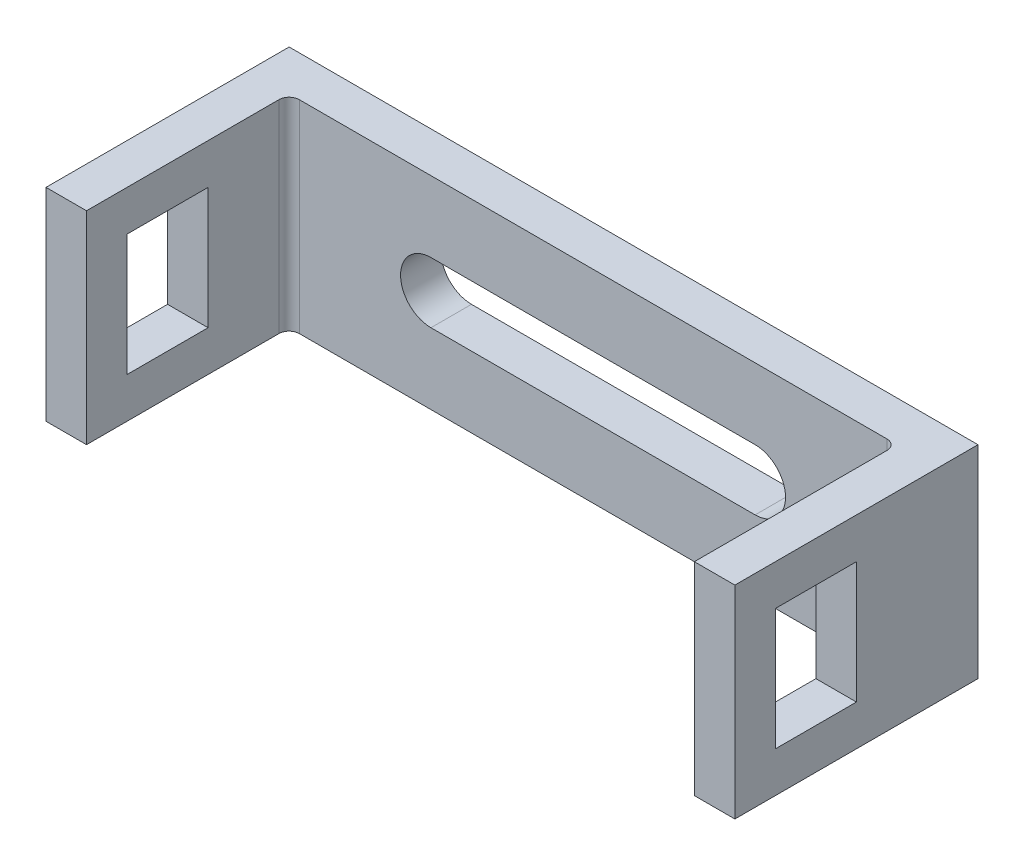
ISO-10303-21;
HEADER;
FILE_DESCRIPTION(('STEP AP214'),'2;1');
FILE_NAME('part.step','',(''),(''),'','','');
FILE_SCHEMA(('AUTOMOTIVE_DESIGN { 1 0 10303 214 1 1 1 1 }'));
ENDSEC;
DATA;
#1=APPLICATION_CONTEXT('core data for automotive mechanical design processes');
#2=APPLICATION_PROTOCOL_DEFINITION('international standard','automotive_design',2000,#1);
#3=PRODUCT_CONTEXT('',#1,'mechanical');
#4=PRODUCT('Part','Part','',(#3));
#5=PRODUCT_RELATED_PRODUCT_CATEGORY('part','',(#4));
#6=PRODUCT_DEFINITION_FORMATION('','',#4);
#7=PRODUCT_DEFINITION_CONTEXT('part definition',#1,'design');
#8=PRODUCT_DEFINITION('design','',#6,#7);
#9=PRODUCT_DEFINITION_SHAPE('','',#8);
#10=(LENGTH_UNIT() NAMED_UNIT(*) SI_UNIT(.MILLI.,.METRE.));
#11=(NAMED_UNIT(*) PLANE_ANGLE_UNIT() SI_UNIT($,.RADIAN.));
#12=(NAMED_UNIT(*) SI_UNIT($,.STERADIAN.) SOLID_ANGLE_UNIT());
#13=UNCERTAINTY_MEASURE_WITH_UNIT(LENGTH_MEASURE(1.E-05),#10,'distance_accuracy_value','');
#14=(GEOMETRIC_REPRESENTATION_CONTEXT(3) GLOBAL_UNCERTAINTY_ASSIGNED_CONTEXT((#13)) GLOBAL_UNIT_ASSIGNED_CONTEXT((#10,
#11,#12)) REPRESENTATION_CONTEXT('',''));
#15=CARTESIAN_POINT('',(0.,0.,0.));
#16=DIRECTION('',(0.,0.,1.));
#17=DIRECTION('',(1.,0.,0.));
#18=AXIS2_PLACEMENT_3D('',#15,#16,#17);
#19=CARTESIAN_POINT('',(17.,5.,2.));
#20=DIRECTION('',(-1.,0.,0.));
#21=DIRECTION('',(0.,0.,1.));
#22=AXIS2_PLACEMENT_3D('',#19,#20,#21);
#23=PLANE('',#22);
#24=DIRECTION('',(0.,0.,1.));
#25=VECTOR('',#24,1.);
#26=CARTESIAN_POINT('',(17.,-3.,2.));
#27=LINE('',#26,#25);
#28=CARTESIAN_POINT('',(17.,-3.,6.));
#29=VERTEX_POINT('',#28);
#30=CARTESIAN_POINT('',(17.,-3.,10.));
#31=VERTEX_POINT('',#30);
#32=EDGE_CURVE('E207',#29,#31,#27,.T.);
#33=ORIENTED_EDGE('',*,*,#32,.T.);
#34=DIRECTION('',(0.,1.,0.));
#35=VECTOR('',#34,1.);
#36=CARTESIAN_POINT('',(17.,5.,10.));
#37=LINE('',#36,#35);
#38=CARTESIAN_POINT('',(17.,3.,10.));
#39=VERTEX_POINT('',#38);
#40=EDGE_CURVE('E219',#31,#39,#37,.T.);
#41=ORIENTED_EDGE('',*,*,#40,.T.);
#42=DIRECTION('',(0.,0.,-1.));
#43=VECTOR('',#42,1.);
#44=CARTESIAN_POINT('',(17.,3.,2.));
#45=LINE('',#44,#43);
#46=CARTESIAN_POINT('',(17.,3.,6.));
#47=VERTEX_POINT('',#46);
#48=EDGE_CURVE('E248',#39,#47,#45,.T.);
#49=ORIENTED_EDGE('',*,*,#48,.T.);
#50=DIRECTION('',(0.,-1.,0.));
#51=VECTOR('',#50,1.);
#52=CARTESIAN_POINT('',(17.,5.,6.));
#53=LINE('',#52,#51);
#54=EDGE_CURVE('E231',#47,#29,#53,.T.);
#55=ORIENTED_EDGE('',*,*,#54,.T.);
#56=EDGE_LOOP('',(#33,#41,#49,#55));
#57=FACE_BOUND('',#56,.T.);
#58=DIRECTION('',(0.,1.,0.));
#59=VECTOR('',#58,1.);
#60=CARTESIAN_POINT('',(17.,5.,0.));
#61=LINE('',#60,#59);
#62=CARTESIAN_POINT('',(17.,-5.,0.));
#63=VERTEX_POINT('',#62);
#64=CARTESIAN_POINT('',(17.,5.,0.));
#65=VERTEX_POINT('',#64);
#66=EDGE_CURVE('E276',#63,#65,#61,.T.);
#67=ORIENTED_EDGE('',*,*,#66,.T.);
#68=DIRECTION('',(0.,0.,-1.));
#69=VECTOR('',#68,1.);
#70=CARTESIAN_POINT('',(17.,5.,2.));
#71=LINE('',#70,#69);
#72=CARTESIAN_POINT('',(17.,5.,12.));
#73=VERTEX_POINT('',#72);
#74=EDGE_CURVE('E329',#73,#65,#71,.T.);
#75=ORIENTED_EDGE('',*,*,#74,.F.);
#76=DIRECTION('',(0.,1.,0.));
#77=VECTOR('',#76,1.);
#78=CARTESIAN_POINT('',(17.,5.,12.));
#79=LINE('',#78,#77);
#80=CARTESIAN_POINT('',(17.,-5.,12.));
#81=VERTEX_POINT('',#80);
#82=EDGE_CURVE('E258',#81,#73,#79,.T.);
#83=ORIENTED_EDGE('',*,*,#82,.F.);
#84=DIRECTION('',(0.,0.,-1.));
#85=VECTOR('',#84,1.);
#86=CARTESIAN_POINT('',(17.,-5.,2.));
#87=LINE('',#86,#85);
#88=EDGE_CURVE('E306',#81,#63,#87,.T.);
#89=ORIENTED_EDGE('',*,*,#88,.T.);
#90=EDGE_LOOP('',(#67,#75,#83,#89));
#91=FACE_BOUND('',#90,.T.);
#92=ADVANCED_FACE('F45',(#57,#91),#23,.F.);
#93=CARTESIAN_POINT('',(-17.,5.,2.));
#94=DIRECTION('',(0.,-1.,0.));
#95=DIRECTION('',(0.,0.,-1.));
#96=AXIS2_PLACEMENT_3D('',#93,#94,#95);
#97=PLANE('',#96);
#98=DIRECTION('',(-1.,0.,0.));
#99=VECTOR('',#98,1.);
#100=CARTESIAN_POINT('',(-17.,5.,0.));
#101=LINE('',#100,#99);
#102=CARTESIAN_POINT('',(-17.,5.,0.));
#103=VERTEX_POINT('',#102);
#104=EDGE_CURVE('E310',#65,#103,#101,.T.);
#105=ORIENTED_EDGE('',*,*,#104,.T.);
#106=DIRECTION('',(0.,0.,-1.));
#107=VECTOR('',#106,1.);
#108=CARTESIAN_POINT('',(-17.,5.,2.));
#109=LINE('',#108,#107);
#110=CARTESIAN_POINT('',(-17.,5.,12.));
#111=VERTEX_POINT('',#110);
#112=EDGE_CURVE('E325',#111,#103,#109,.T.);
#113=ORIENTED_EDGE('',*,*,#112,.F.);
#114=DIRECTION('',(-1.,0.,0.));
#115=VECTOR('',#114,1.);
#116=CARTESIAN_POINT('',(-17.,5.,12.));
#117=LINE('',#116,#115);
#118=CARTESIAN_POINT('',(-15.,5.,12.));
#119=VERTEX_POINT('',#118);
#120=EDGE_CURVE('E264',#119,#111,#117,.T.);
#121=ORIENTED_EDGE('',*,*,#120,.F.);
#122=DIRECTION('',(0.,0.,-1.));
#123=VECTOR('',#122,1.);
#124=CARTESIAN_POINT('',(-15.,5.,12.));
#125=LINE('',#124,#123);
#126=CARTESIAN_POINT('',(-15.,5.,2.5));
#127=VERTEX_POINT('',#126);
#128=EDGE_CURVE('E268',#119,#127,#125,.T.);
#129=ORIENTED_EDGE('',*,*,#128,.T.);
#130=CARTESIAN_POINT('',(-14.5,5.,2.5));
#131=DIRECTION('',(0.,-1.,0.));
#132=DIRECTION('',(0.,0.,-1.));
#133=AXIS2_PLACEMENT_3D('',#130,#131,#132);
#134=CIRCLE('',#133,0.5);
#135=CARTESIAN_POINT('',(-14.5,5.,2.));
#136=VERTEX_POINT('',#135);
#137=EDGE_CURVE('E353',#127,#136,#134,.T.);
#138=ORIENTED_EDGE('',*,*,#137,.T.);
#139=DIRECTION('',(-1.,0.,0.));
#140=VECTOR('',#139,1.);
#141=CARTESIAN_POINT('',(-17.,5.,2.));
#142=LINE('',#141,#140);
#143=CARTESIAN_POINT('',(14.5,5.,2.));
#144=VERTEX_POINT('',#143);
#145=EDGE_CURVE('E297',#144,#136,#142,.T.);
#146=ORIENTED_EDGE('',*,*,#145,.F.);
#147=CARTESIAN_POINT('',(14.5,5.,2.5));
#148=DIRECTION('',(0.,-1.,0.));
#149=DIRECTION('',(0.,0.,-1.));
#150=AXIS2_PLACEMENT_3D('',#147,#148,#149);
#151=CIRCLE('',#150,0.5);
#152=CARTESIAN_POINT('',(15.,5.,2.5));
#153=VERTEX_POINT('',#152);
#154=EDGE_CURVE('E350',#144,#153,#151,.T.);
#155=ORIENTED_EDGE('',*,*,#154,.T.);
#156=DIRECTION('',(0.,0.,-1.));
#157=VECTOR('',#156,1.);
#158=CARTESIAN_POINT('',(15.,5.,12.));
#159=LINE('',#158,#157);
#160=CARTESIAN_POINT('',(15.,5.,12.));
#161=VERTEX_POINT('',#160);
#162=EDGE_CURVE('E226',#161,#153,#159,.T.);
#163=ORIENTED_EDGE('',*,*,#162,.F.);
#164=DIRECTION('',(-1.,0.,0.));
#165=VECTOR('',#164,1.);
#166=CARTESIAN_POINT('',(17.,5.,12.));
#167=LINE('',#166,#165);
#168=EDGE_CURVE('E291',#73,#161,#167,.T.);
#169=ORIENTED_EDGE('',*,*,#168,.F.);
#170=ORIENTED_EDGE('',*,*,#74,.T.);
#171=EDGE_LOOP('',(#105,#113,#121,#129,#138,#146,#155,#163,#169,#170));
#172=FACE_BOUND('',#171,.T.);
#173=ADVANCED_FACE('F472',(#172),#97,.F.);
#174=CARTESIAN_POINT('',(-17.,5.,2.));
#175=DIRECTION('',(1.,0.,0.));
#176=DIRECTION('',(0.,1.,0.));
#177=AXIS2_PLACEMENT_3D('',#174,#175,#176);
#178=PLANE('',#177);
#179=DIRECTION('',(0.,0.,1.));
#180=VECTOR('',#179,1.);
#181=CARTESIAN_POINT('',(-17.,3.,10.));
#182=LINE('',#181,#180);
#183=CARTESIAN_POINT('',(-17.,3.,6.));
#184=VERTEX_POINT('',#183);
#185=CARTESIAN_POINT('',(-17.,3.,10.));
#186=VERTEX_POINT('',#185);
#187=EDGE_CURVE('E215',#184,#186,#182,.T.);
#188=ORIENTED_EDGE('',*,*,#187,.T.);
#189=DIRECTION('',(0.,-1.,0.));
#190=VECTOR('',#189,1.);
#191=CARTESIAN_POINT('',(-17.,3.,10.));
#192=LINE('',#191,#190);
#193=CARTESIAN_POINT('',(-17.,-3.,10.));
#194=VERTEX_POINT('',#193);
#195=EDGE_CURVE('E416',#186,#194,#192,.T.);
#196=ORIENTED_EDGE('',*,*,#195,.T.);
#197=DIRECTION('',(0.,0.,-1.));
#198=VECTOR('',#197,1.);
#199=CARTESIAN_POINT('',(-17.,-3.,10.));
#200=LINE('',#199,#198);
#201=CARTESIAN_POINT('',(-17.,-3.,6.));
#202=VERTEX_POINT('',#201);
#203=EDGE_CURVE('E420',#194,#202,#200,.T.);
#204=ORIENTED_EDGE('',*,*,#203,.T.);
#205=DIRECTION('',(0.,1.,0.));
#206=VECTOR('',#205,1.);
#207=CARTESIAN_POINT('',(-17.,3.,6.));
#208=LINE('',#207,#206);
#209=EDGE_CURVE('E198',#202,#184,#208,.T.);
#210=ORIENTED_EDGE('',*,*,#209,.T.);
#211=EDGE_LOOP('',(#188,#196,#204,#210));
#212=FACE_BOUND('',#211,.T.);
#213=DIRECTION('',(0.,-1.,0.));
#214=VECTOR('',#213,1.);
#215=CARTESIAN_POINT('',(-17.,5.,0.));
#216=LINE('',#215,#214);
#217=CARTESIAN_POINT('',(-17.,-5.,0.));
#218=VERTEX_POINT('',#217);
#219=EDGE_CURVE('E313',#103,#218,#216,.T.);
#220=ORIENTED_EDGE('',*,*,#219,.T.);
#221=DIRECTION('',(0.,0.,-1.));
#222=VECTOR('',#221,1.);
#223=CARTESIAN_POINT('',(-17.,-5.,2.));
#224=LINE('',#223,#222);
#225=CARTESIAN_POINT('',(-17.,-5.,12.));
#226=VERTEX_POINT('',#225);
#227=EDGE_CURVE('E321',#226,#218,#224,.T.);
#228=ORIENTED_EDGE('',*,*,#227,.F.);
#229=DIRECTION('',(0.,-1.,0.));
#230=VECTOR('',#229,1.);
#231=CARTESIAN_POINT('',(-17.,5.,12.));
#232=LINE('',#231,#230);
#233=EDGE_CURVE('E253',#111,#226,#232,.T.);
#234=ORIENTED_EDGE('',*,*,#233,.F.);
#235=ORIENTED_EDGE('',*,*,#112,.T.);
#236=EDGE_LOOP('',(#220,#228,#234,#235));
#237=FACE_BOUND('',#236,.T.);
#238=ADVANCED_FACE('F479',(#212,#237),#178,.F.);
#239=CARTESIAN_POINT('',(-17.,-5.,2.));
#240=DIRECTION('',(0.,1.,0.));
#241=DIRECTION('',(0.,0.,1.));
#242=AXIS2_PLACEMENT_3D('',#239,#240,#241);
#243=PLANE('',#242);
#244=DIRECTION('',(1.,0.,0.));
#245=VECTOR('',#244,1.);
#246=CARTESIAN_POINT('',(-17.,-5.,0.));
#247=LINE('',#246,#245);
#248=EDGE_CURVE('E302',#218,#63,#247,.T.);
#249=ORIENTED_EDGE('',*,*,#248,.T.);
#250=ORIENTED_EDGE('',*,*,#88,.F.);
#251=DIRECTION('',(1.,0.,0.));
#252=VECTOR('',#251,1.);
#253=CARTESIAN_POINT('',(17.,-5.,12.));
#254=LINE('',#253,#252);
#255=CARTESIAN_POINT('',(15.,-5.,12.));
#256=VERTEX_POINT('',#255);
#257=EDGE_CURVE('E284',#256,#81,#254,.T.);
#258=ORIENTED_EDGE('',*,*,#257,.F.);
#259=DIRECTION('',(0.,0.,-1.));
#260=VECTOR('',#259,1.);
#261=CARTESIAN_POINT('',(15.,-5.,12.));
#262=LINE('',#261,#260);
#263=CARTESIAN_POINT('',(15.,-5.,2.5));
#264=VERTEX_POINT('',#263);
#265=EDGE_CURVE('E280',#256,#264,#262,.T.);
#266=ORIENTED_EDGE('',*,*,#265,.T.);
#267=CARTESIAN_POINT('',(14.5,-5.,2.5));
#268=DIRECTION('',(0.,1.,0.));
#269=DIRECTION('',(0.,0.,1.));
#270=AXIS2_PLACEMENT_3D('',#267,#268,#269);
#271=CIRCLE('',#270,0.5);
#272=CARTESIAN_POINT('',(14.5,-5.,2.));
#273=VERTEX_POINT('',#272);
#274=EDGE_CURVE('E347',#264,#273,#271,.T.);
#275=ORIENTED_EDGE('',*,*,#274,.T.);
#276=DIRECTION('',(1.,0.,0.));
#277=VECTOR('',#276,1.);
#278=CARTESIAN_POINT('',(-17.,-5.,2.));
#279=LINE('',#278,#277);
#280=CARTESIAN_POINT('',(-14.5,-5.,2.));
#281=VERTEX_POINT('',#280);
#282=EDGE_CURVE('E301',#281,#273,#279,.T.);
#283=ORIENTED_EDGE('',*,*,#282,.F.);
#284=CARTESIAN_POINT('',(-14.5,-5.,2.5));
#285=DIRECTION('',(0.,1.,0.));
#286=DIRECTION('',(0.,0.,1.));
#287=AXIS2_PLACEMENT_3D('',#284,#285,#286);
#288=CIRCLE('',#287,0.5);
#289=CARTESIAN_POINT('',(-15.,-5.,2.5));
#290=VERTEX_POINT('',#289);
#291=EDGE_CURVE('E356',#281,#290,#288,.T.);
#292=ORIENTED_EDGE('',*,*,#291,.T.);
#293=DIRECTION('',(0.,0.,-1.));
#294=VECTOR('',#293,1.);
#295=CARTESIAN_POINT('',(-15.,-5.,12.));
#296=LINE('',#295,#294);
#297=CARTESIAN_POINT('',(-15.,-5.,12.));
#298=VERTEX_POINT('',#297);
#299=EDGE_CURVE('E272',#298,#290,#296,.T.);
#300=ORIENTED_EDGE('',*,*,#299,.F.);
#301=DIRECTION('',(1.,0.,0.));
#302=VECTOR('',#301,1.);
#303=CARTESIAN_POINT('',(-17.,-5.,12.));
#304=LINE('',#303,#302);
#305=EDGE_CURVE('E257',#226,#298,#304,.T.);
#306=ORIENTED_EDGE('',*,*,#305,.F.);
#307=ORIENTED_EDGE('',*,*,#227,.T.);
#308=EDGE_LOOP('',(#249,#250,#258,#266,#275,#283,#292,#300,#306,#307));
#309=FACE_BOUND('',#308,.T.);
#310=ADVANCED_FACE('F515',(#309),#243,.F.);
#311=CARTESIAN_POINT('',(0.,0.,2.));
#312=DIRECTION('',(0.,0.,1.));
#313=DIRECTION('',(1.,0.,0.));
#314=AXIS2_PLACEMENT_3D('',#311,#312,#313);
#315=PLANE('',#314);
#316=CARTESIAN_POINT('',(8.,0.,2.));
#317=DIRECTION('',(0.,0.,1.));
#318=DIRECTION('',(1.,0.,0.));
#319=AXIS2_PLACEMENT_3D('',#316,#317,#318);
#320=CIRCLE('',#319,1.5);
#321=CARTESIAN_POINT('',(8.,-1.5,2.));
#322=VERTEX_POINT('',#321);
#323=CARTESIAN_POINT('',(8.,1.5,2.));
#324=VERTEX_POINT('',#323);
#325=EDGE_CURVE('E395',#322,#324,#320,.T.);
#326=ORIENTED_EDGE('',*,*,#325,.F.);
#327=DIRECTION('',(1.,0.,0.));
#328=VECTOR('',#327,1.);
#329=CARTESIAN_POINT('',(0.,-1.5,2.));
#330=LINE('',#329,#328);
#331=CARTESIAN_POINT('',(-8.,-1.5,2.));
#332=VERTEX_POINT('',#331);
#333=EDGE_CURVE('E397',#332,#322,#330,.T.);
#334=ORIENTED_EDGE('',*,*,#333,.F.);
#335=CARTESIAN_POINT('',(-8.,0.,2.));
#336=DIRECTION('',(0.,0.,1.));
#337=DIRECTION('',(1.,0.,0.));
#338=AXIS2_PLACEMENT_3D('',#335,#336,#337);
#339=CIRCLE('',#338,1.5);
#340=CARTESIAN_POINT('',(-8.,1.5,2.));
#341=VERTEX_POINT('',#340);
#342=EDGE_CURVE('E401',#341,#332,#339,.T.);
#343=ORIENTED_EDGE('',*,*,#342,.F.);
#344=DIRECTION('',(-1.,0.,0.));
#345=VECTOR('',#344,1.);
#346=CARTESIAN_POINT('',(0.,1.5,2.));
#347=LINE('',#346,#345);
#348=EDGE_CURVE('E89',#324,#341,#347,.T.);
#349=ORIENTED_EDGE('',*,*,#348,.F.);
#350=EDGE_LOOP('',(#326,#334,#343,#349));
#351=FACE_BOUND('',#350,.T.);
#352=ORIENTED_EDGE('',*,*,#282,.T.);
#353=DIRECTION('',(0.,-1.,0.));
#354=VECTOR('',#353,1.);
#355=CARTESIAN_POINT('',(14.5,0.,2.));
#356=LINE('',#355,#354);
#357=EDGE_CURVE('E340',#273,#144,#356,.F.);
#358=ORIENTED_EDGE('',*,*,#357,.T.);
#359=ORIENTED_EDGE('',*,*,#145,.T.);
#360=DIRECTION('',(0.,1.,0.));
#361=VECTOR('',#360,1.);
#362=CARTESIAN_POINT('',(-14.5,0.,2.));
#363=LINE('',#362,#361);
#364=EDGE_CURVE('E337',#136,#281,#363,.F.);
#365=ORIENTED_EDGE('',*,*,#364,.T.);
#366=EDGE_LOOP('',(#352,#358,#359,#365));
#367=FACE_BOUND('',#366,.T.);
#368=ADVANCED_FACE('F526',(#351,#367),#315,.T.);
#369=CARTESIAN_POINT('',(0.,0.,0.));
#370=DIRECTION('',(0.,0.,1.));
#371=DIRECTION('',(1.,0.,0.));
#372=AXIS2_PLACEMENT_3D('',#369,#370,#371);
#373=PLANE('',#372);
#374=DIRECTION('',(1.,0.,0.));
#375=VECTOR('',#374,1.);
#376=CARTESIAN_POINT('',(0.,-1.5,0.));
#377=LINE('',#376,#375);
#378=CARTESIAN_POINT('',(-8.,-1.5,0.));
#379=VERTEX_POINT('',#378);
#380=CARTESIAN_POINT('',(8.,-1.5,0.));
#381=VERTEX_POINT('',#380);
#382=EDGE_CURVE('E375',#379,#381,#377,.T.);
#383=ORIENTED_EDGE('',*,*,#382,.T.);
#384=CARTESIAN_POINT('',(8.,0.,0.));
#385=DIRECTION('',(0.,0.,-1.));
#386=DIRECTION('',(-1.,0.,0.));
#387=AXIS2_PLACEMENT_3D('',#384,#385,#386);
#388=CIRCLE('',#387,1.5);
#389=CARTESIAN_POINT('',(8.,1.5,0.));
#390=VERTEX_POINT('',#389);
#391=EDGE_CURVE('E11',#381,#390,#388,.F.);
#392=ORIENTED_EDGE('',*,*,#391,.T.);
#393=DIRECTION('',(1.,0.,0.));
#394=VECTOR('',#393,1.);
#395=CARTESIAN_POINT('',(0.,1.5,0.));
#396=LINE('',#395,#394);
#397=CARTESIAN_POINT('',(-8.,1.5,0.));
#398=VERTEX_POINT('',#397);
#399=EDGE_CURVE('E55',#390,#398,#396,.F.);
#400=ORIENTED_EDGE('',*,*,#399,.T.);
#401=CARTESIAN_POINT('',(-8.,0.,0.));
#402=DIRECTION('',(0.,0.,-1.));
#403=DIRECTION('',(-1.,0.,0.));
#404=AXIS2_PLACEMENT_3D('',#401,#402,#403);
#405=CIRCLE('',#404,1.5);
#406=EDGE_CURVE('E80',#398,#379,#405,.F.);
#407=ORIENTED_EDGE('',*,*,#406,.T.);
#408=EDGE_LOOP('',(#383,#392,#400,#407));
#409=FACE_BOUND('',#408,.T.);
#410=ORIENTED_EDGE('',*,*,#66,.F.);
#411=ORIENTED_EDGE('',*,*,#248,.F.);
#412=ORIENTED_EDGE('',*,*,#219,.F.);
#413=ORIENTED_EDGE('',*,*,#104,.F.);
#414=EDGE_LOOP('',(#410,#411,#412,#413));
#415=FACE_BOUND('',#414,.T.);
#416=ADVANCED_FACE('F384',(#409,#415),#373,.F.);
#417=CARTESIAN_POINT('',(15.,5.,12.));
#418=DIRECTION('',(1.,0.,0.));
#419=DIRECTION('',(0.,0.,-1.));
#420=AXIS2_PLACEMENT_3D('',#417,#418,#419);
#421=PLANE('',#420);
#422=DIRECTION('',(0.,0.,1.));
#423=VECTOR('',#422,1.);
#424=CARTESIAN_POINT('',(15.,3.,12.));
#425=LINE('',#424,#423);
#426=CARTESIAN_POINT('',(15.,3.,6.));
#427=VERTEX_POINT('',#426);
#428=CARTESIAN_POINT('',(15.,3.,10.));
#429=VERTEX_POINT('',#428);
#430=EDGE_CURVE('E244',#427,#429,#425,.T.);
#431=ORIENTED_EDGE('',*,*,#430,.T.);
#432=DIRECTION('',(0.,-1.,0.));
#433=VECTOR('',#432,1.);
#434=CARTESIAN_POINT('',(15.,5.,10.));
#435=LINE('',#434,#433);
#436=CARTESIAN_POINT('',(15.,-3.,10.));
#437=VERTEX_POINT('',#436);
#438=EDGE_CURVE('E227',#429,#437,#435,.T.);
#439=ORIENTED_EDGE('',*,*,#438,.T.);
#440=DIRECTION('',(0.,0.,-1.));
#441=VECTOR('',#440,1.);
#442=CARTESIAN_POINT('',(15.,-3.,12.));
#443=LINE('',#442,#441);
#444=CARTESIAN_POINT('',(15.,-3.,6.));
#445=VERTEX_POINT('',#444);
#446=EDGE_CURVE('E210',#437,#445,#443,.T.);
#447=ORIENTED_EDGE('',*,*,#446,.T.);
#448=DIRECTION('',(0.,1.,0.));
#449=VECTOR('',#448,1.);
#450=CARTESIAN_POINT('',(15.,5.,6.));
#451=LINE('',#450,#449);
#452=EDGE_CURVE('E233',#445,#427,#451,.T.);
#453=ORIENTED_EDGE('',*,*,#452,.T.);
#454=EDGE_LOOP('',(#431,#439,#447,#453));
#455=FACE_BOUND('',#454,.T.);
#456=ORIENTED_EDGE('',*,*,#162,.T.);
#457=DIRECTION('',(0.,-1.,0.));
#458=VECTOR('',#457,1.);
#459=CARTESIAN_POINT('',(15.,5.,2.5));
#460=LINE('',#459,#458);
#461=EDGE_CURVE('E333',#153,#264,#460,.T.);
#462=ORIENTED_EDGE('',*,*,#461,.T.);
#463=ORIENTED_EDGE('',*,*,#265,.F.);
#464=DIRECTION('',(0.,-1.,0.));
#465=VECTOR('',#464,1.);
#466=CARTESIAN_POINT('',(15.,5.,12.));
#467=LINE('',#466,#465);
#468=EDGE_CURVE('E288',#161,#256,#467,.T.);
#469=ORIENTED_EDGE('',*,*,#468,.F.);
#470=EDGE_LOOP('',(#456,#462,#463,#469));
#471=FACE_BOUND('',#470,.T.);
#472=ADVANCED_FACE('F451',(#455,#471),#421,.F.);
#473=CARTESIAN_POINT('',(0.,0.,12.));
#474=DIRECTION('',(0.,0.,-1.));
#475=DIRECTION('',(-1.,0.,0.));
#476=AXIS2_PLACEMENT_3D('',#473,#474,#475);
#477=PLANE('',#476);
#478=ORIENTED_EDGE('',*,*,#82,.T.);
#479=ORIENTED_EDGE('',*,*,#168,.T.);
#480=ORIENTED_EDGE('',*,*,#468,.T.);
#481=ORIENTED_EDGE('',*,*,#257,.T.);
#482=EDGE_LOOP('',(#478,#479,#480,#481));
#483=FACE_BOUND('',#482,.T.);
#484=ADVANCED_FACE('F506',(#483),#477,.F.);
#485=CARTESIAN_POINT('',(-15.,5.,12.));
#486=DIRECTION('',(-1.,0.,0.));
#487=DIRECTION('',(0.,0.,1.));
#488=AXIS2_PLACEMENT_3D('',#485,#486,#487);
#489=PLANE('',#488);
#490=DIRECTION('',(0.,0.,1.));
#491=VECTOR('',#490,1.);
#492=CARTESIAN_POINT('',(-15.,-3.,12.));
#493=LINE('',#492,#491);
#494=CARTESIAN_POINT('',(-15.,-3.,6.));
#495=VERTEX_POINT('',#494);
#496=CARTESIAN_POINT('',(-15.,-3.,10.));
#497=VERTEX_POINT('',#496);
#498=EDGE_CURVE('E359',#495,#497,#493,.T.);
#499=ORIENTED_EDGE('',*,*,#498,.T.);
#500=DIRECTION('',(0.,1.,0.));
#501=VECTOR('',#500,1.);
#502=CARTESIAN_POINT('',(-15.,5.,10.));
#503=LINE('',#502,#501);
#504=CARTESIAN_POINT('',(-15.,3.,10.));
#505=VERTEX_POINT('',#504);
#506=EDGE_CURVE('E371',#497,#505,#503,.T.);
#507=ORIENTED_EDGE('',*,*,#506,.T.);
#508=DIRECTION('',(0.,0.,-1.));
#509=VECTOR('',#508,1.);
#510=CARTESIAN_POINT('',(-15.,3.,12.));
#511=LINE('',#510,#509);
#512=CARTESIAN_POINT('',(-15.,3.,6.));
#513=VERTEX_POINT('',#512);
#514=EDGE_CURVE('E367',#505,#513,#511,.T.);
#515=ORIENTED_EDGE('',*,*,#514,.T.);
#516=DIRECTION('',(0.,-1.,0.));
#517=VECTOR('',#516,1.);
#518=CARTESIAN_POINT('',(-15.,5.,6.));
#519=LINE('',#518,#517);
#520=EDGE_CURVE('E363',#513,#495,#519,.T.);
#521=ORIENTED_EDGE('',*,*,#520,.T.);
#522=EDGE_LOOP('',(#499,#507,#515,#521));
#523=FACE_BOUND('',#522,.T.);
#524=ORIENTED_EDGE('',*,*,#299,.T.);
#525=DIRECTION('',(0.,1.,0.));
#526=VECTOR('',#525,1.);
#527=CARTESIAN_POINT('',(-15.,5.,2.5));
#528=LINE('',#527,#526);
#529=EDGE_CURVE('E343',#290,#127,#528,.T.);
#530=ORIENTED_EDGE('',*,*,#529,.T.);
#531=ORIENTED_EDGE('',*,*,#128,.F.);
#532=DIRECTION('',(0.,1.,0.));
#533=VECTOR('',#532,1.);
#534=CARTESIAN_POINT('',(-15.,5.,12.));
#535=LINE('',#534,#533);
#536=EDGE_CURVE('E261',#298,#119,#535,.T.);
#537=ORIENTED_EDGE('',*,*,#536,.F.);
#538=EDGE_LOOP('',(#524,#530,#531,#537));
#539=FACE_BOUND('',#538,.T.);
#540=ADVANCED_FACE('F493',(#523,#539),#489,.F.);
#541=CARTESIAN_POINT('',(0.,0.,12.));
#542=DIRECTION('',(0.,0.,1.));
#543=DIRECTION('',(1.,0.,0.));
#544=AXIS2_PLACEMENT_3D('',#541,#542,#543);
#545=PLANE('',#544);
#546=ORIENTED_EDGE('',*,*,#233,.T.);
#547=ORIENTED_EDGE('',*,*,#305,.T.);
#548=ORIENTED_EDGE('',*,*,#536,.T.);
#549=ORIENTED_EDGE('',*,*,#120,.T.);
#550=EDGE_LOOP('',(#546,#547,#548,#549));
#551=FACE_BOUND('',#550,.T.);
#552=ADVANCED_FACE('F485',(#551),#545,.T.);
#553=CARTESIAN_POINT('',(14.5,5.,2.5));
#554=DIRECTION('',(0.,-1.,0.));
#555=DIRECTION('',(0.,0.,-1.));
#556=AXIS2_PLACEMENT_3D('',#553,#554,#555);
#557=CYLINDRICAL_SURFACE('',#556,0.5);
#558=ORIENTED_EDGE('',*,*,#154,.F.);
#559=ORIENTED_EDGE('',*,*,#357,.F.);
#560=ORIENTED_EDGE('',*,*,#274,.F.);
#561=ORIENTED_EDGE('',*,*,#461,.F.);
#562=EDGE_LOOP('',(#558,#559,#560,#561));
#563=FACE_BOUND('',#562,.T.);
#564=ADVANCED_FACE('F483',(#563),#557,.F.);
#565=CARTESIAN_POINT('',(-14.5,5.,2.5));
#566=DIRECTION('',(0.,1.,0.));
#567=DIRECTION('',(0.,0.,1.));
#568=AXIS2_PLACEMENT_3D('',#565,#566,#567);
#569=CYLINDRICAL_SURFACE('',#568,0.5);
#570=ORIENTED_EDGE('',*,*,#291,.F.);
#571=ORIENTED_EDGE('',*,*,#364,.F.);
#572=ORIENTED_EDGE('',*,*,#137,.F.);
#573=ORIENTED_EDGE('',*,*,#529,.F.);
#574=EDGE_LOOP('',(#570,#571,#572,#573));
#575=FACE_BOUND('',#574,.T.);
#576=ADVANCED_FACE('F47',(#575),#569,.F.);
#577=CARTESIAN_POINT('',(-17.,-3.,10.));
#578=DIRECTION('',(0.,-1.,0.));
#579=DIRECTION('',(0.,0.,-1.));
#580=AXIS2_PLACEMENT_3D('',#577,#578,#579);
#581=PLANE('',#580);
#582=DIRECTION('',(1.,0.,0.));
#583=VECTOR('',#582,1.);
#584=CARTESIAN_POINT('',(-17.,-3.,6.));
#585=LINE('',#584,#583);
#586=EDGE_CURVE('E437',#202,#495,#585,.T.);
#587=ORIENTED_EDGE('',*,*,#586,.F.);
#588=ORIENTED_EDGE('',*,*,#203,.F.);
#589=DIRECTION('',(1.,0.,0.));
#590=VECTOR('',#589,1.);
#591=CARTESIAN_POINT('',(-17.,-3.,10.));
#592=LINE('',#591,#590);
#593=EDGE_CURVE('E214',#194,#497,#592,.T.);
#594=ORIENTED_EDGE('',*,*,#593,.T.);
#595=ORIENTED_EDGE('',*,*,#498,.F.);
#596=EDGE_LOOP('',(#587,#588,#594,#595));
#597=FACE_BOUND('',#596,.T.);
#598=ADVANCED_FACE('F490',(#597),#581,.F.);
#599=CARTESIAN_POINT('',(-17.,3.,6.));
#600=DIRECTION('',(0.,0.,-1.));
#601=DIRECTION('',(-1.,0.,0.));
#602=AXIS2_PLACEMENT_3D('',#599,#600,#601);
#603=PLANE('',#602);
#604=DIRECTION('',(1.,0.,0.));
#605=VECTOR('',#604,1.);
#606=CARTESIAN_POINT('',(-17.,3.,6.));
#607=LINE('',#606,#605);
#608=EDGE_CURVE('E432',#184,#513,#607,.T.);
#609=ORIENTED_EDGE('',*,*,#608,.F.);
#610=ORIENTED_EDGE('',*,*,#209,.F.);
#611=ORIENTED_EDGE('',*,*,#586,.T.);
#612=ORIENTED_EDGE('',*,*,#520,.F.);
#613=EDGE_LOOP('',(#609,#610,#611,#612));
#614=FACE_BOUND('',#613,.T.);
#615=ADVANCED_FACE('F465',(#614),#603,.F.);
#616=CARTESIAN_POINT('',(-17.,3.,10.));
#617=DIRECTION('',(0.,1.,0.));
#618=DIRECTION('',(0.,0.,1.));
#619=AXIS2_PLACEMENT_3D('',#616,#617,#618);
#620=PLANE('',#619);
#621=DIRECTION('',(1.,0.,0.));
#622=VECTOR('',#621,1.);
#623=CARTESIAN_POINT('',(-17.,3.,10.));
#624=LINE('',#623,#622);
#625=EDGE_CURVE('E239',#186,#505,#624,.T.);
#626=ORIENTED_EDGE('',*,*,#625,.F.);
#627=ORIENTED_EDGE('',*,*,#187,.F.);
#628=ORIENTED_EDGE('',*,*,#608,.T.);
#629=ORIENTED_EDGE('',*,*,#514,.F.);
#630=EDGE_LOOP('',(#626,#627,#628,#629));
#631=FACE_BOUND('',#630,.T.);
#632=ADVANCED_FACE('F459',(#631),#620,.F.);
#633=CARTESIAN_POINT('',(-17.,3.,10.));
#634=DIRECTION('',(0.,0.,1.));
#635=DIRECTION('',(1.,0.,0.));
#636=AXIS2_PLACEMENT_3D('',#633,#634,#635);
#637=PLANE('',#636);
#638=ORIENTED_EDGE('',*,*,#593,.F.);
#639=ORIENTED_EDGE('',*,*,#195,.F.);
#640=ORIENTED_EDGE('',*,*,#625,.T.);
#641=ORIENTED_EDGE('',*,*,#506,.F.);
#642=EDGE_LOOP('',(#638,#639,#640,#641));
#643=FACE_BOUND('',#642,.T.);
#644=ADVANCED_FACE('F466',(#643),#637,.F.);
#645=EDGE_CURVE('E203',#437,#31,#592,.T.);
#646=ORIENTED_EDGE('',*,*,#645,.F.);
#647=ORIENTED_EDGE('',*,*,#438,.F.);
#648=EDGE_CURVE('E222',#429,#39,#624,.T.);
#649=ORIENTED_EDGE('',*,*,#648,.T.);
#650=ORIENTED_EDGE('',*,*,#40,.F.);
#651=EDGE_LOOP('',(#646,#647,#649,#650));
#652=FACE_BOUND('',#651,.T.);
#653=ADVANCED_FACE('F220',(#652),#637,.F.);
#654=ORIENTED_EDGE('',*,*,#648,.F.);
#655=ORIENTED_EDGE('',*,*,#430,.F.);
#656=EDGE_CURVE('E436',#427,#47,#607,.T.);
#657=ORIENTED_EDGE('',*,*,#656,.T.);
#658=ORIENTED_EDGE('',*,*,#48,.F.);
#659=EDGE_LOOP('',(#654,#655,#657,#658));
#660=FACE_BOUND('',#659,.T.);
#661=ADVANCED_FACE('F454',(#660),#620,.F.);
#662=ORIENTED_EDGE('',*,*,#656,.F.);
#663=ORIENTED_EDGE('',*,*,#452,.F.);
#664=EDGE_CURVE('E439',#445,#29,#585,.T.);
#665=ORIENTED_EDGE('',*,*,#664,.T.);
#666=ORIENTED_EDGE('',*,*,#54,.F.);
#667=EDGE_LOOP('',(#662,#663,#665,#666));
#668=FACE_BOUND('',#667,.T.);
#669=ADVANCED_FACE('F448',(#668),#603,.F.);
#670=ORIENTED_EDGE('',*,*,#664,.F.);
#671=ORIENTED_EDGE('',*,*,#446,.F.);
#672=ORIENTED_EDGE('',*,*,#645,.T.);
#673=ORIENTED_EDGE('',*,*,#32,.F.);
#674=EDGE_LOOP('',(#670,#671,#672,#673));
#675=FACE_BOUND('',#674,.T.);
#676=ADVANCED_FACE('F205',(#675),#581,.F.);
#677=CARTESIAN_POINT('',(8.,0.,12.));
#678=DIRECTION('',(0.,0.,-1.));
#679=DIRECTION('',(-1.,0.,0.));
#680=AXIS2_PLACEMENT_3D('',#677,#678,#679);
#681=CYLINDRICAL_SURFACE('',#680,1.5);
#682=ORIENTED_EDGE('',*,*,#325,.T.);
#683=DIRECTION('',(0.,0.,-1.));
#684=VECTOR('',#683,1.);
#685=CARTESIAN_POINT('',(8.,1.5,12.));
#686=LINE('',#685,#684);
#687=EDGE_CURVE('E389',#324,#390,#686,.T.);
#688=ORIENTED_EDGE('',*,*,#687,.T.);
#689=ORIENTED_EDGE('',*,*,#391,.F.);
#690=DIRECTION('',(0.,0.,-1.));
#691=VECTOR('',#690,1.);
#692=CARTESIAN_POINT('',(8.,-1.5,12.));
#693=LINE('',#692,#691);
#694=EDGE_CURVE('E405',#322,#381,#693,.T.);
#695=ORIENTED_EDGE('',*,*,#694,.F.);
#696=EDGE_LOOP('',(#682,#688,#689,#695));
#697=FACE_BOUND('',#696,.T.);
#698=ADVANCED_FACE('F392',(#697),#681,.F.);
#699=CARTESIAN_POINT('',(8.,1.5,12.));
#700=DIRECTION('',(0.,1.,0.));
#701=DIRECTION('',(-1.,0.,0.));
#702=AXIS2_PLACEMENT_3D('',#699,#700,#701);
#703=PLANE('',#702);
#704=ORIENTED_EDGE('',*,*,#348,.T.);
#705=DIRECTION('',(0.,0.,-1.));
#706=VECTOR('',#705,1.);
#707=CARTESIAN_POINT('',(-8.,1.5,12.));
#708=LINE('',#707,#706);
#709=EDGE_CURVE('E390',#341,#398,#708,.T.);
#710=ORIENTED_EDGE('',*,*,#709,.T.);
#711=ORIENTED_EDGE('',*,*,#399,.F.);
#712=ORIENTED_EDGE('',*,*,#687,.F.);
#713=EDGE_LOOP('',(#704,#710,#711,#712));
#714=FACE_BOUND('',#713,.T.);
#715=ADVANCED_FACE('F388',(#714),#703,.F.);
#716=CARTESIAN_POINT('',(-8.,0.,12.));
#717=DIRECTION('',(0.,0.,-1.));
#718=DIRECTION('',(-1.,0.,0.));
#719=AXIS2_PLACEMENT_3D('',#716,#717,#718);
#720=CYLINDRICAL_SURFACE('',#719,1.5);
#721=ORIENTED_EDGE('',*,*,#342,.T.);
#722=DIRECTION('',(0.,0.,-1.));
#723=VECTOR('',#722,1.);
#724=CARTESIAN_POINT('',(-8.,-1.5,12.));
#725=LINE('',#724,#723);
#726=EDGE_CURVE('E63',#332,#379,#725,.T.);
#727=ORIENTED_EDGE('',*,*,#726,.T.);
#728=ORIENTED_EDGE('',*,*,#406,.F.);
#729=ORIENTED_EDGE('',*,*,#709,.F.);
#730=EDGE_LOOP('',(#721,#727,#728,#729));
#731=FACE_BOUND('',#730,.T.);
#732=ADVANCED_FACE('F651',(#731),#720,.F.);
#733=CARTESIAN_POINT('',(8.,-1.5,12.));
#734=DIRECTION('',(0.,-1.,0.));
#735=DIRECTION('',(0.,0.,-1.));
#736=AXIS2_PLACEMENT_3D('',#733,#734,#735);
#737=PLANE('',#736);
#738=ORIENTED_EDGE('',*,*,#333,.T.);
#739=ORIENTED_EDGE('',*,*,#694,.T.);
#740=ORIENTED_EDGE('',*,*,#382,.F.);
#741=ORIENTED_EDGE('',*,*,#726,.F.);
#742=EDGE_LOOP('',(#738,#739,#740,#741));
#743=FACE_BOUND('',#742,.T.);
#744=ADVANCED_FACE('F660',(#743),#737,.F.);
#745=CLOSED_SHELL('',(#92,#173,#238,#310,#368,#416,#472,#484,#540,#552,#564,#576,#598,#615,#632,
#644,#653,#661,#669,#676,#698,#715,#732,#744));
#746=MANIFOLD_SOLID_BREP('B2',#745);
#747=ADVANCED_BREP_SHAPE_REPRESENTATION('',(#18,#746),#14);
#748=SHAPE_DEFINITION_REPRESENTATION(#9,#747);
ENDSEC;
END-ISO-10303-21;
